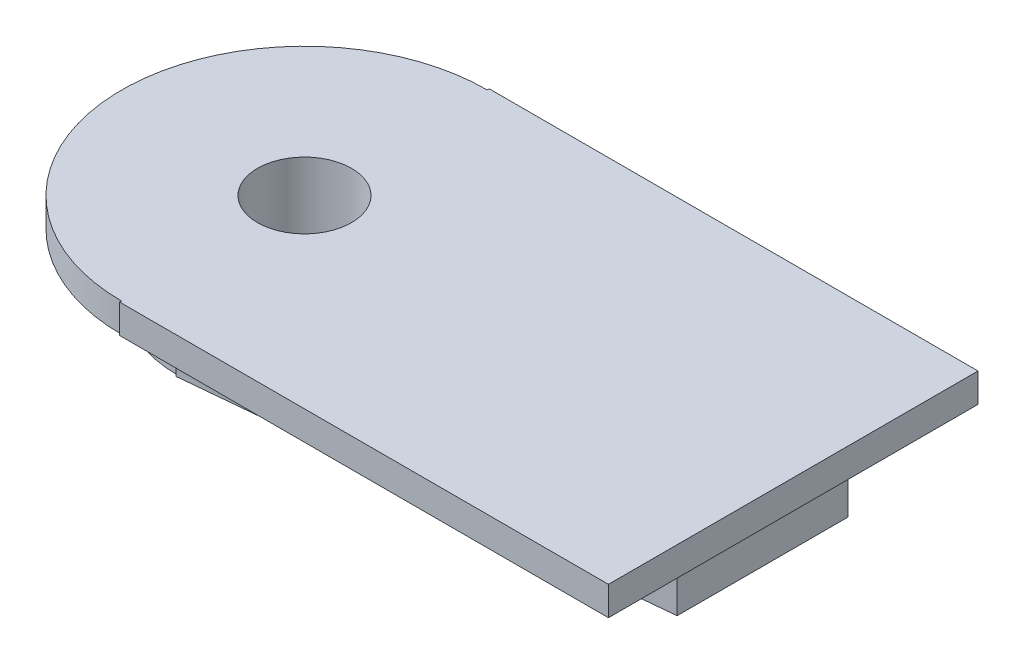
ISO-10303-21;
HEADER;
FILE_DESCRIPTION(('STEP AP214'),'2;1');
FILE_NAME('part.step','',(''),(''),'','','');
FILE_SCHEMA(('AUTOMOTIVE_DESIGN { 1 0 10303 214 1 1 1 1 }'));
ENDSEC;
DATA;
#1=APPLICATION_CONTEXT('core data for automotive mechanical design processes');
#2=APPLICATION_PROTOCOL_DEFINITION('international standard','automotive_design',2000,#1);
#3=PRODUCT_CONTEXT('',#1,'mechanical');
#4=PRODUCT('Part','Part','',(#3));
#5=PRODUCT_RELATED_PRODUCT_CATEGORY('part','',(#4));
#6=PRODUCT_DEFINITION_FORMATION('','',#4);
#7=PRODUCT_DEFINITION_CONTEXT('part definition',#1,'design');
#8=PRODUCT_DEFINITION('design','',#6,#7);
#9=PRODUCT_DEFINITION_SHAPE('','',#8);
#10=(LENGTH_UNIT() NAMED_UNIT(*) SI_UNIT(.MILLI.,.METRE.));
#11=(NAMED_UNIT(*) PLANE_ANGLE_UNIT() SI_UNIT($,.RADIAN.));
#12=(NAMED_UNIT(*) SI_UNIT($,.STERADIAN.) SOLID_ANGLE_UNIT());
#13=UNCERTAINTY_MEASURE_WITH_UNIT(LENGTH_MEASURE(1.E-05),#10,'distance_accuracy_value','');
#14=(GEOMETRIC_REPRESENTATION_CONTEXT(3) GLOBAL_UNCERTAINTY_ASSIGNED_CONTEXT((#13)) GLOBAL_UNIT_ASSIGNED_CONTEXT((#10,
#11,#12)) REPRESENTATION_CONTEXT('',''));
#15=CARTESIAN_POINT('',(0.,0.,0.));
#16=DIRECTION('',(0.,0.,1.));
#17=DIRECTION('',(1.,0.,0.));
#18=AXIS2_PLACEMENT_3D('',#15,#16,#17);
#19=CARTESIAN_POINT('',(0.,24.3,0.));
#20=DIRECTION('',(0.,-1.,0.));
#21=DIRECTION('',(0.,0.,-1.));
#22=AXIS2_PLACEMENT_3D('',#19,#20,#21);
#23=CYLINDRICAL_SURFACE('',#22,5.05);
#24=DIRECTION('',(0.,-1.,0.));
#25=VECTOR('',#24,1.);
#26=CARTESIAN_POINT('',(0.,24.3,5.05));
#27=LINE('',#26,#25);
#28=CARTESIAN_POINT('',(0.,24.3,5.05));
#29=VERTEX_POINT('',#28);
#30=CARTESIAN_POINT('',(0.,23.5,5.05));
#31=VERTEX_POINT('',#30);
#32=EDGE_CURVE('E158',#29,#31,#27,.T.);
#33=ORIENTED_EDGE('',*,*,#32,.F.);
#34=CARTESIAN_POINT('',(0.,24.3,0.));
#35=DIRECTION('',(0.,1.,0.));
#36=DIRECTION('',(0.,0.,1.));
#37=AXIS2_PLACEMENT_3D('',#34,#35,#36);
#38=CIRCLE('',#37,5.05);
#39=CARTESIAN_POINT('',(0.,24.3,-5.05));
#40=VERTEX_POINT('',#39);
#41=EDGE_CURVE('E133',#40,#29,#38,.T.);
#42=ORIENTED_EDGE('',*,*,#41,.F.);
#43=DIRECTION('',(0.,-1.,0.));
#44=VECTOR('',#43,1.);
#45=CARTESIAN_POINT('',(0.,24.3,-5.05));
#46=LINE('',#45,#44);
#47=CARTESIAN_POINT('',(0.,23.5,-5.05));
#48=VERTEX_POINT('',#47);
#49=EDGE_CURVE('E60',#48,#40,#46,.F.);
#50=ORIENTED_EDGE('',*,*,#49,.F.);
#51=CARTESIAN_POINT('',(0.,23.5,0.));
#52=DIRECTION('',(0.,1.,0.));
#53=DIRECTION('',(0.,0.,1.));
#54=AXIS2_PLACEMENT_3D('',#51,#52,#53);
#55=CIRCLE('',#54,5.05);
#56=EDGE_CURVE('E55',#48,#31,#55,.T.);
#57=ORIENTED_EDGE('',*,*,#56,.T.);
#58=EDGE_LOOP('',(#33,#42,#50,#57));
#59=FACE_BOUND('',#58,.T.);
#60=ADVANCED_FACE('F39',(#59),#23,.T.);
#61=CARTESIAN_POINT('',(0.,23.5,0.));
#62=DIRECTION('',(0.,-1.,0.));
#63=DIRECTION('',(0.,0.,-1.));
#64=AXIS2_PLACEMENT_3D('',#61,#62,#63);
#65=CYLINDRICAL_SURFACE('',#64,3.5);
#66=DIRECTION('',(0.,-1.,0.));
#67=VECTOR('',#66,1.);
#68=CARTESIAN_POINT('',(0.,23.5,3.5));
#69=LINE('',#68,#67);
#70=CARTESIAN_POINT('',(0.,23.5,3.5));
#71=VERTEX_POINT('',#70);
#72=CARTESIAN_POINT('',(0.,21.75,3.5));
#73=VERTEX_POINT('',#72);
#74=EDGE_CURVE('E219',#71,#73,#69,.T.);
#75=ORIENTED_EDGE('',*,*,#74,.F.);
#76=CARTESIAN_POINT('',(0.,23.5,0.));
#77=DIRECTION('',(0.,1.,0.));
#78=DIRECTION('',(0.,0.,1.));
#79=AXIS2_PLACEMENT_3D('',#76,#77,#78);
#80=CIRCLE('',#79,3.5);
#81=CARTESIAN_POINT('',(0.,23.5,-3.5));
#82=VERTEX_POINT('',#81);
#83=EDGE_CURVE('E11',#82,#71,#80,.T.);
#84=ORIENTED_EDGE('',*,*,#83,.F.);
#85=DIRECTION('',(0.,-1.,0.));
#86=VECTOR('',#85,1.);
#87=CARTESIAN_POINT('',(0.,23.5,-3.5));
#88=LINE('',#87,#86);
#89=CARTESIAN_POINT('',(0.,21.75,-3.5));
#90=VERTEX_POINT('',#89);
#91=EDGE_CURVE('E215',#90,#82,#88,.F.);
#92=ORIENTED_EDGE('',*,*,#91,.F.);
#93=CARTESIAN_POINT('',(0.,21.75,0.));
#94=DIRECTION('',(0.,1.,0.));
#95=DIRECTION('',(0.,0.,1.));
#96=AXIS2_PLACEMENT_3D('',#93,#94,#95);
#97=CIRCLE('',#96,3.5);
#98=EDGE_CURVE('E43',#90,#73,#97,.T.);
#99=ORIENTED_EDGE('',*,*,#98,.T.);
#100=EDGE_LOOP('',(#75,#84,#92,#99));
#101=FACE_BOUND('',#100,.T.);
#102=ADVANCED_FACE('F41',(#101),#65,.T.);
#103=CARTESIAN_POINT('',(0.,21.75,0.));
#104=DIRECTION('',(0.,1.,0.));
#105=DIRECTION('',(0.,0.,1.));
#106=AXIS2_PLACEMENT_3D('',#103,#104,#105);
#107=PLANE('',#106);
#108=CARTESIAN_POINT('',(0.,21.75,0.));
#109=DIRECTION('',(0.,1.,0.));
#110=DIRECTION('',(0.,0.,1.));
#111=AXIS2_PLACEMENT_3D('',#108,#109,#110);
#112=CIRCLE('',#111,1.3);
#113=CARTESIAN_POINT('',(0.,21.75,1.3));
#114=VERTEX_POINT('',#113);
#115=EDGE_CURVE('E400',#114,#114,#112,.T.);
#116=ORIENTED_EDGE('',*,*,#115,.T.);
#117=EDGE_LOOP('',(#116));
#118=FACE_BOUND('',#117,.T.);
#119=ORIENTED_EDGE('',*,*,#98,.F.);
#120=DIRECTION('',(0.,0.,1.));
#121=VECTOR('',#120,1.);
#122=CARTESIAN_POINT('',(0.,21.75,-3.55356197040492));
#123=LINE('',#122,#121);
#124=CARTESIAN_POINT('',(0.,21.75,-3.55356197040492));
#125=VERTEX_POINT('',#124);
#126=EDGE_CURVE('E187',#125,#90,#123,.T.);
#127=ORIENTED_EDGE('',*,*,#126,.F.);
#128=DIRECTION('',(-0.99556196460308,0.,-0.0941083133185143));
#129=VECTOR('',#128,1.);
#130=CARTESIAN_POINT('',(12.65,21.75,-2.35778490598701));
#131=LINE('',#130,#129);
#132=CARTESIAN_POINT('',(12.65,21.75,-2.35778490598701));
#133=VERTEX_POINT('',#132);
#134=EDGE_CURVE('E197',#133,#125,#131,.T.);
#135=ORIENTED_EDGE('',*,*,#134,.F.);
#136=DIRECTION('',(0.,0.,-1.));
#137=VECTOR('',#136,1.);
#138=CARTESIAN_POINT('',(12.65,21.75,2.35778490598701));
#139=LINE('',#138,#137);
#140=CARTESIAN_POINT('',(12.65,21.75,2.35778490598701));
#141=VERTEX_POINT('',#140);
#142=EDGE_CURVE('E194',#141,#133,#139,.T.);
#143=ORIENTED_EDGE('',*,*,#142,.F.);
#144=DIRECTION('',(0.99556196460308,0.,-0.0941083133185143));
#145=VECTOR('',#144,1.);
#146=CARTESIAN_POINT('',(0.,21.75,3.55356197040492));
#147=LINE('',#146,#145);
#148=CARTESIAN_POINT('',(0.,21.75,3.55356197040492));
#149=VERTEX_POINT('',#148);
#150=EDGE_CURVE('E191',#149,#141,#147,.T.);
#151=ORIENTED_EDGE('',*,*,#150,.F.);
#152=EDGE_CURVE('E168',#73,#149,#123,.T.);
#153=ORIENTED_EDGE('',*,*,#152,.F.);
#154=EDGE_LOOP('',(#119,#127,#135,#143,#151,#153));
#155=FACE_BOUND('',#154,.T.);
#156=ADVANCED_FACE('F230',(#118,#155),#107,.F.);
#157=CARTESIAN_POINT('',(0.,23.5,-3.55356197040492));
#158=DIRECTION('',(1.,0.,0.));
#159=DIRECTION('',(0.,0.,-1.));
#160=AXIS2_PLACEMENT_3D('',#157,#158,#159);
#161=PLANE('',#160);
#162=DIRECTION('',(0.,0.,1.));
#163=VECTOR('',#162,1.);
#164=CARTESIAN_POINT('',(0.,23.5,-3.55356197040492));
#165=LINE('',#164,#163);
#166=CARTESIAN_POINT('',(0.,23.5,3.55356197040492));
#167=VERTEX_POINT('',#166);
#168=EDGE_CURVE('E176',#71,#167,#165,.T.);
#169=ORIENTED_EDGE('',*,*,#168,.F.);
#170=ORIENTED_EDGE('',*,*,#74,.T.);
#171=ORIENTED_EDGE('',*,*,#152,.T.);
#172=DIRECTION('',(0.,-1.,0.));
#173=VECTOR('',#172,1.);
#174=CARTESIAN_POINT('',(0.,23.5,3.55356197040492));
#175=LINE('',#174,#173);
#176=EDGE_CURVE('E211',#167,#149,#175,.T.);
#177=ORIENTED_EDGE('',*,*,#176,.F.);
#178=EDGE_LOOP('',(#169,#170,#171,#177));
#179=FACE_BOUND('',#178,.T.);
#180=ADVANCED_FACE('F242',(#179),#161,.F.);
#181=ORIENTED_EDGE('',*,*,#126,.T.);
#182=ORIENTED_EDGE('',*,*,#91,.T.);
#183=CARTESIAN_POINT('',(0.,23.5,-3.55356197040492));
#184=VERTEX_POINT('',#183);
#185=EDGE_CURVE('E171',#184,#82,#165,.T.);
#186=ORIENTED_EDGE('',*,*,#185,.F.);
#187=DIRECTION('',(0.,-1.,0.));
#188=VECTOR('',#187,1.);
#189=CARTESIAN_POINT('',(0.,23.5,-3.55356197040492));
#190=LINE('',#189,#188);
#191=EDGE_CURVE('E186',#184,#125,#190,.T.);
#192=ORIENTED_EDGE('',*,*,#191,.T.);
#193=EDGE_LOOP('',(#181,#182,#186,#192));
#194=FACE_BOUND('',#193,.T.);
#195=ADVANCED_FACE('F254',(#194),#161,.F.);
#196=CARTESIAN_POINT('',(0.,23.5,3.55356197040492));
#197=DIRECTION('',(-0.0941083133185143,0.,-0.99556196460308));
#198=DIRECTION('',(-0.99556196460308,0.,0.0941083133185143));
#199=AXIS2_PLACEMENT_3D('',#196,#197,#198);
#200=PLANE('',#199);
#201=ORIENTED_EDGE('',*,*,#150,.T.);
#202=DIRECTION('',(0.,-1.,0.));
#203=VECTOR('',#202,1.);
#204=CARTESIAN_POINT('',(12.65,23.5,2.35778490598701));
#205=LINE('',#204,#203);
#206=CARTESIAN_POINT('',(12.65,23.5,2.35778490598701));
#207=VERTEX_POINT('',#206);
#208=EDGE_CURVE('E207',#207,#141,#205,.T.);
#209=ORIENTED_EDGE('',*,*,#208,.F.);
#210=DIRECTION('',(0.99556196460308,0.,-0.0941083133185143));
#211=VECTOR('',#210,1.);
#212=CARTESIAN_POINT('',(0.,23.5,3.55356197040492));
#213=LINE('',#212,#211);
#214=EDGE_CURVE('E175',#167,#207,#213,.T.);
#215=ORIENTED_EDGE('',*,*,#214,.F.);
#216=ORIENTED_EDGE('',*,*,#176,.T.);
#217=EDGE_LOOP('',(#201,#209,#215,#216));
#218=FACE_BOUND('',#217,.T.);
#219=ADVANCED_FACE('F244',(#218),#200,.F.);
#220=CARTESIAN_POINT('',(12.65,23.5,2.35778490598701));
#221=DIRECTION('',(-1.,0.,0.));
#222=DIRECTION('',(0.,0.,1.));
#223=AXIS2_PLACEMENT_3D('',#220,#221,#222);
#224=PLANE('',#223);
#225=ORIENTED_EDGE('',*,*,#142,.T.);
#226=DIRECTION('',(0.,-1.,0.));
#227=VECTOR('',#226,1.);
#228=CARTESIAN_POINT('',(12.65,23.5,-2.35778490598701));
#229=LINE('',#228,#227);
#230=CARTESIAN_POINT('',(12.65,23.5,-2.35778490598701));
#231=VERTEX_POINT('',#230);
#232=EDGE_CURVE('E203',#231,#133,#229,.T.);
#233=ORIENTED_EDGE('',*,*,#232,.F.);
#234=DIRECTION('',(0.,0.,-1.));
#235=VECTOR('',#234,1.);
#236=CARTESIAN_POINT('',(12.65,23.5,2.35778490598701));
#237=LINE('',#236,#235);
#238=EDGE_CURVE('E179',#207,#231,#237,.T.);
#239=ORIENTED_EDGE('',*,*,#238,.F.);
#240=ORIENTED_EDGE('',*,*,#208,.T.);
#241=EDGE_LOOP('',(#225,#233,#239,#240));
#242=FACE_BOUND('',#241,.T.);
#243=ADVANCED_FACE('F247',(#242),#224,.F.);
#244=CARTESIAN_POINT('',(12.65,23.5,-2.35778490598701));
#245=DIRECTION('',(-0.0941083133185143,0.,0.99556196460308));
#246=DIRECTION('',(0.99556196460308,0.,0.0941083133185143));
#247=AXIS2_PLACEMENT_3D('',#244,#245,#246);
#248=PLANE('',#247);
#249=ORIENTED_EDGE('',*,*,#134,.T.);
#250=ORIENTED_EDGE('',*,*,#191,.F.);
#251=DIRECTION('',(-0.99556196460308,0.,-0.0941083133185143));
#252=VECTOR('',#251,1.);
#253=CARTESIAN_POINT('',(12.65,23.5,-2.35778490598701));
#254=LINE('',#253,#252);
#255=EDGE_CURVE('E183',#231,#184,#254,.T.);
#256=ORIENTED_EDGE('',*,*,#255,.F.);
#257=ORIENTED_EDGE('',*,*,#232,.T.);
#258=EDGE_LOOP('',(#249,#250,#256,#257));
#259=FACE_BOUND('',#258,.T.);
#260=ADVANCED_FACE('F252',(#259),#248,.F.);
#261=CARTESIAN_POINT('',(0.,23.5,0.));
#262=DIRECTION('',(0.,1.,0.));
#263=DIRECTION('',(0.,0.,1.));
#264=AXIS2_PLACEMENT_3D('',#261,#262,#263);
#265=PLANE('',#264);
#266=ORIENTED_EDGE('',*,*,#168,.T.);
#267=ORIENTED_EDGE('',*,*,#214,.T.);
#268=ORIENTED_EDGE('',*,*,#238,.T.);
#269=ORIENTED_EDGE('',*,*,#255,.T.);
#270=ORIENTED_EDGE('',*,*,#185,.T.);
#271=ORIENTED_EDGE('',*,*,#83,.T.);
#272=EDGE_LOOP('',(#266,#267,#268,#269,#270,#271));
#273=FACE_BOUND('',#272,.T.);
#274=DIRECTION('',(0.,0.,1.));
#275=VECTOR('',#274,1.);
#276=CARTESIAN_POINT('',(0.,23.5,5.10378486137277));
#277=LINE('',#276,#275);
#278=CARTESIAN_POINT('',(0.,23.5,5.10378486137277));
#279=VERTEX_POINT('',#278);
#280=EDGE_CURVE('E152',#31,#279,#277,.T.);
#281=ORIENTED_EDGE('',*,*,#280,.F.);
#282=ORIENTED_EDGE('',*,*,#56,.F.);
#283=CARTESIAN_POINT('',(0.,23.5,-5.10378486137277));
#284=VERTEX_POINT('',#283);
#285=EDGE_CURVE('E406',#284,#48,#277,.T.);
#286=ORIENTED_EDGE('',*,*,#285,.F.);
#287=DIRECTION('',(-1.,0.,0.));
#288=VECTOR('',#287,1.);
#289=CARTESIAN_POINT('',(0.,23.5,-5.10378486137277));
#290=LINE('',#289,#288);
#291=CARTESIAN_POINT('',(13.5,23.5,-5.10378486137277));
#292=VERTEX_POINT('',#291);
#293=EDGE_CURVE('E138',#292,#284,#290,.T.);
#294=ORIENTED_EDGE('',*,*,#293,.F.);
#295=DIRECTION('',(0.,0.,-1.));
#296=VECTOR('',#295,1.);
#297=CARTESIAN_POINT('',(13.5,23.5,5.10378486137277));
#298=LINE('',#297,#296);
#299=CARTESIAN_POINT('',(13.5,23.5,5.10378486137277));
#300=VERTEX_POINT('',#299);
#301=EDGE_CURVE('E423',#300,#292,#298,.T.);
#302=ORIENTED_EDGE('',*,*,#301,.F.);
#303=DIRECTION('',(1.,0.,0.));
#304=VECTOR('',#303,1.);
#305=CARTESIAN_POINT('',(0.,23.5,5.10378486137277));
#306=LINE('',#305,#304);
#307=EDGE_CURVE('E420',#279,#300,#306,.T.);
#308=ORIENTED_EDGE('',*,*,#307,.F.);
#309=EDGE_LOOP('',(#281,#282,#286,#294,#302,#308));
#310=FACE_BOUND('',#309,.T.);
#311=ADVANCED_FACE('F239',(#273,#310),#265,.F.);
#312=CARTESIAN_POINT('',(0.,24.3,0.));
#313=DIRECTION('',(0.,1.,0.));
#314=DIRECTION('',(0.,0.,1.));
#315=AXIS2_PLACEMENT_3D('',#312,#313,#314);
#316=PLANE('',#315);
#317=CARTESIAN_POINT('',(0.,24.3,0.));
#318=DIRECTION('',(0.,1.,0.));
#319=DIRECTION('',(0.,0.,1.));
#320=AXIS2_PLACEMENT_3D('',#317,#318,#319);
#321=CIRCLE('',#320,1.3);
#322=CARTESIAN_POINT('',(0.,24.3,1.3));
#323=VERTEX_POINT('',#322);
#324=EDGE_CURVE('E402',#323,#323,#321,.T.);
#325=ORIENTED_EDGE('',*,*,#324,.F.);
#326=EDGE_LOOP('',(#325));
#327=FACE_BOUND('',#326,.T.);
#328=ORIENTED_EDGE('',*,*,#41,.T.);
#329=DIRECTION('',(0.,0.,1.));
#330=VECTOR('',#329,1.);
#331=CARTESIAN_POINT('',(0.,24.3,5.10378486137277));
#332=LINE('',#331,#330);
#333=CARTESIAN_POINT('',(0.,24.3,5.10378486137277));
#334=VERTEX_POINT('',#333);
#335=EDGE_CURVE('E127',#29,#334,#332,.T.);
#336=ORIENTED_EDGE('',*,*,#335,.T.);
#337=DIRECTION('',(1.,0.,0.));
#338=VECTOR('',#337,1.);
#339=CARTESIAN_POINT('',(0.,24.3,5.10378486137277));
#340=LINE('',#339,#338);
#341=CARTESIAN_POINT('',(13.5,24.3,5.10378486137277));
#342=VERTEX_POINT('',#341);
#343=EDGE_CURVE('E130',#334,#342,#340,.T.);
#344=ORIENTED_EDGE('',*,*,#343,.T.);
#345=DIRECTION('',(0.,0.,-1.));
#346=VECTOR('',#345,1.);
#347=CARTESIAN_POINT('',(13.5,24.3,5.10378486137277));
#348=LINE('',#347,#346);
#349=CARTESIAN_POINT('',(13.5,24.3,-5.10378486137277));
#350=VERTEX_POINT('',#349);
#351=EDGE_CURVE('E148',#342,#350,#348,.T.);
#352=ORIENTED_EDGE('',*,*,#351,.T.);
#353=DIRECTION('',(-1.,0.,0.));
#354=VECTOR('',#353,1.);
#355=CARTESIAN_POINT('',(0.,24.3,-5.10378486137277));
#356=LINE('',#355,#354);
#357=CARTESIAN_POINT('',(0.,24.3,-5.10378486137277));
#358=VERTEX_POINT('',#357);
#359=EDGE_CURVE('E414',#350,#358,#356,.T.);
#360=ORIENTED_EDGE('',*,*,#359,.T.);
#361=EDGE_CURVE('E137',#358,#40,#332,.T.);
#362=ORIENTED_EDGE('',*,*,#361,.T.);
#363=EDGE_LOOP('',(#328,#336,#344,#352,#360,#362));
#364=FACE_BOUND('',#363,.T.);
#365=ADVANCED_FACE('F129',(#327,#364),#316,.T.);
#366=CARTESIAN_POINT('',(0.,24.3,5.10378486137277));
#367=DIRECTION('',(1.,0.,0.));
#368=DIRECTION('',(0.,0.,-1.));
#369=AXIS2_PLACEMENT_3D('',#366,#367,#368);
#370=PLANE('',#369);
#371=ORIENTED_EDGE('',*,*,#335,.F.);
#372=ORIENTED_EDGE('',*,*,#32,.T.);
#373=ORIENTED_EDGE('',*,*,#280,.T.);
#374=DIRECTION('',(0.,-1.,0.));
#375=VECTOR('',#374,1.);
#376=CARTESIAN_POINT('',(0.,24.3,5.10378486137277));
#377=LINE('',#376,#375);
#378=EDGE_CURVE('E143',#334,#279,#377,.T.);
#379=ORIENTED_EDGE('',*,*,#378,.F.);
#380=EDGE_LOOP('',(#371,#372,#373,#379));
#381=FACE_BOUND('',#380,.T.);
#382=ADVANCED_FACE('F150',(#381),#370,.F.);
#383=ORIENTED_EDGE('',*,*,#285,.T.);
#384=ORIENTED_EDGE('',*,*,#49,.T.);
#385=ORIENTED_EDGE('',*,*,#361,.F.);
#386=DIRECTION('',(0.,-1.,0.));
#387=VECTOR('',#386,1.);
#388=CARTESIAN_POINT('',(0.,24.3,-5.10378486137277));
#389=LINE('',#388,#387);
#390=EDGE_CURVE('E416',#358,#284,#389,.T.);
#391=ORIENTED_EDGE('',*,*,#390,.T.);
#392=EDGE_LOOP('',(#383,#384,#385,#391));
#393=FACE_BOUND('',#392,.T.);
#394=ADVANCED_FACE('F300',(#393),#370,.F.);
#395=CARTESIAN_POINT('',(0.,24.3,5.10378486137277));
#396=DIRECTION('',(0.,0.,-1.));
#397=DIRECTION('',(-1.,0.,0.));
#398=AXIS2_PLACEMENT_3D('',#395,#396,#397);
#399=PLANE('',#398);
#400=ORIENTED_EDGE('',*,*,#307,.T.);
#401=DIRECTION('',(0.,-1.,0.));
#402=VECTOR('',#401,1.);
#403=CARTESIAN_POINT('',(13.5,24.3,5.10378486137277));
#404=LINE('',#403,#402);
#405=EDGE_CURVE('E145',#342,#300,#404,.T.);
#406=ORIENTED_EDGE('',*,*,#405,.F.);
#407=ORIENTED_EDGE('',*,*,#343,.F.);
#408=ORIENTED_EDGE('',*,*,#378,.T.);
#409=EDGE_LOOP('',(#400,#406,#407,#408));
#410=FACE_BOUND('',#409,.T.);
#411=ADVANCED_FACE('F142',(#410),#399,.F.);
#412=CARTESIAN_POINT('',(13.5,24.3,5.10378486137277));
#413=DIRECTION('',(-1.,0.,0.));
#414=DIRECTION('',(0.,0.,1.));
#415=AXIS2_PLACEMENT_3D('',#412,#413,#414);
#416=PLANE('',#415);
#417=ORIENTED_EDGE('',*,*,#301,.T.);
#418=DIRECTION('',(0.,-1.,0.));
#419=VECTOR('',#418,1.);
#420=CARTESIAN_POINT('',(13.5,24.3,-5.10378486137277));
#421=LINE('',#420,#419);
#422=EDGE_CURVE('E160',#350,#292,#421,.T.);
#423=ORIENTED_EDGE('',*,*,#422,.F.);
#424=ORIENTED_EDGE('',*,*,#351,.F.);
#425=ORIENTED_EDGE('',*,*,#405,.T.);
#426=EDGE_LOOP('',(#417,#423,#424,#425));
#427=FACE_BOUND('',#426,.T.);
#428=ADVANCED_FACE('F313',(#427),#416,.F.);
#429=CARTESIAN_POINT('',(0.,24.3,-5.10378486137277));
#430=DIRECTION('',(0.,0.,1.));
#431=DIRECTION('',(1.,0.,0.));
#432=AXIS2_PLACEMENT_3D('',#429,#430,#431);
#433=PLANE('',#432);
#434=ORIENTED_EDGE('',*,*,#293,.T.);
#435=ORIENTED_EDGE('',*,*,#390,.F.);
#436=ORIENTED_EDGE('',*,*,#359,.F.);
#437=ORIENTED_EDGE('',*,*,#422,.T.);
#438=EDGE_LOOP('',(#434,#435,#436,#437));
#439=FACE_BOUND('',#438,.T.);
#440=ADVANCED_FACE('F320',(#439),#433,.F.);
#441=CARTESIAN_POINT('',(0.,21.75,0.));
#442=DIRECTION('',(0.,1.,0.));
#443=DIRECTION('',(0.,0.,1.));
#444=AXIS2_PLACEMENT_3D('',#441,#442,#443);
#445=CYLINDRICAL_SURFACE('',#444,1.3);
#446=ORIENTED_EDGE('',*,*,#115,.F.);
#447=EDGE_LOOP('',(#446));
#448=FACE_BOUND('',#447,.T.);
#449=ORIENTED_EDGE('',*,*,#324,.T.);
#450=EDGE_LOOP('',(#449));
#451=FACE_BOUND('',#450,.T.);
#452=ADVANCED_FACE('F328',(#448,#451),#445,.F.);
#453=CLOSED_SHELL('',(#60,#102,#156,#180,#195,#219,#243,#260,#311,#365,#382,#394,#411,#428,#440,#452));
#454=MANIFOLD_SOLID_BREP('B2',#453);
#455=ADVANCED_BREP_SHAPE_REPRESENTATION('',(#18,#454),#14);
#456=SHAPE_DEFINITION_REPRESENTATION(#9,#455);
ENDSEC;
END-ISO-10303-21;
